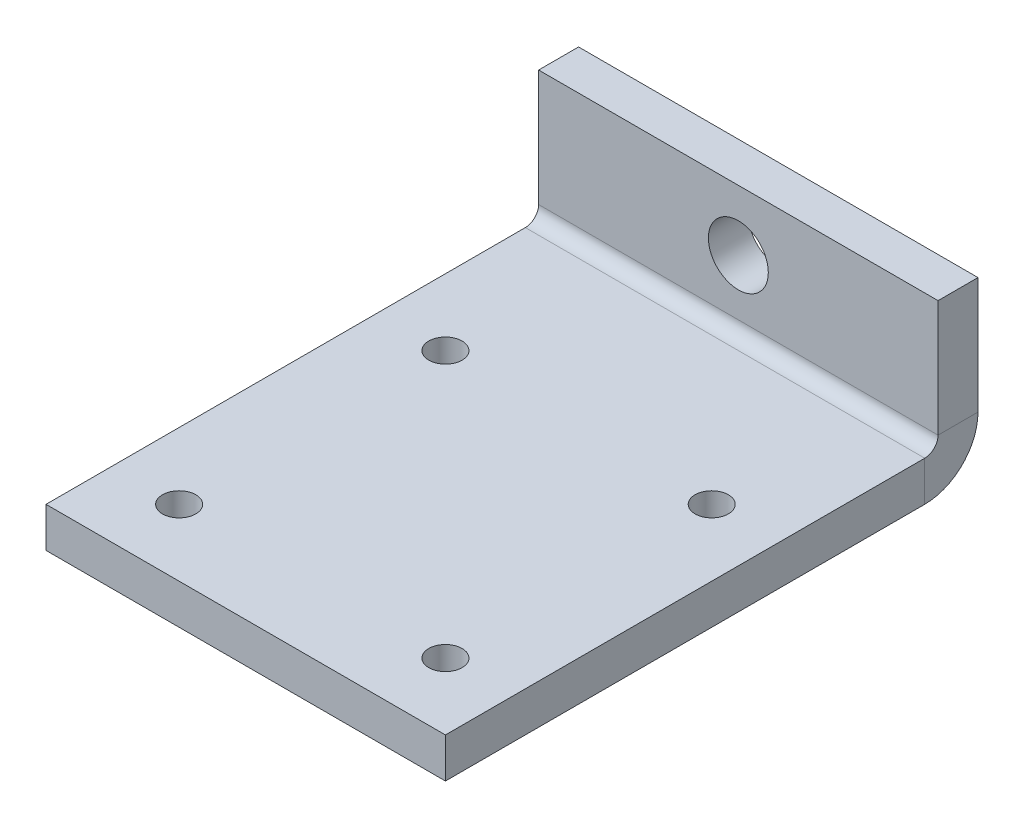
ISO-10303-21;
HEADER;
FILE_DESCRIPTION(('STEP AP214'),'2;1');
FILE_NAME('part.step','',(''),(''),'','','');
FILE_SCHEMA(('AUTOMOTIVE_DESIGN { 1 0 10303 214 1 1 1 1 }'));
ENDSEC;
DATA;
#1=APPLICATION_CONTEXT('core data for automotive mechanical design processes');
#2=APPLICATION_PROTOCOL_DEFINITION('international standard','automotive_design',2000,#1);
#3=PRODUCT_CONTEXT('',#1,'mechanical');
#4=PRODUCT('Part','Part','',(#3));
#5=PRODUCT_RELATED_PRODUCT_CATEGORY('part','',(#4));
#6=PRODUCT_DEFINITION_FORMATION('','',#4);
#7=PRODUCT_DEFINITION_CONTEXT('part definition',#1,'design');
#8=PRODUCT_DEFINITION('design','',#6,#7);
#9=PRODUCT_DEFINITION_SHAPE('','',#8);
#10=(LENGTH_UNIT() NAMED_UNIT(*) SI_UNIT(.MILLI.,.METRE.));
#11=(NAMED_UNIT(*) PLANE_ANGLE_UNIT() SI_UNIT($,.RADIAN.));
#12=(NAMED_UNIT(*) SI_UNIT($,.STERADIAN.) SOLID_ANGLE_UNIT());
#13=UNCERTAINTY_MEASURE_WITH_UNIT(LENGTH_MEASURE(1.E-05),#10,'distance_accuracy_value','');
#14=(GEOMETRIC_REPRESENTATION_CONTEXT(3) GLOBAL_UNCERTAINTY_ASSIGNED_CONTEXT((#13)) GLOBAL_UNIT_ASSIGNED_CONTEXT((#10,
#11,#12)) REPRESENTATION_CONTEXT('',''));
#15=CARTESIAN_POINT('',(0.,0.,0.));
#16=DIRECTION('',(0.,0.,1.));
#17=DIRECTION('',(1.,0.,0.));
#18=AXIS2_PLACEMENT_3D('',#15,#16,#17);
#19=CARTESIAN_POINT('',(30.,0.,4.));
#20=DIRECTION('',(1.,0.,0.));
#21=DIRECTION('',(0.,0.,-1.));
#22=AXIS2_PLACEMENT_3D('',#19,#20,#21);
#23=PLANE('',#22);
#24=DIRECTION('',(0.,1.,0.));
#25=VECTOR('',#24,1.);
#26=CARTESIAN_POINT('',(30.,0.,4.));
#27=LINE('',#26,#25);
#28=CARTESIAN_POINT('',(30.,0.,4.));
#29=VERTEX_POINT('',#28);
#30=CARTESIAN_POINT('',(30.,3.,4.));
#31=VERTEX_POINT('',#30);
#32=EDGE_CURVE('E11',#29,#31,#27,.T.);
#33=ORIENTED_EDGE('',*,*,#32,.F.);
#34=CARTESIAN_POINT('',(30.,4.,4.));
#35=DIRECTION('',(-1.,0.,0.));
#36=DIRECTION('',(0.,0.,1.));
#37=AXIS2_PLACEMENT_3D('',#34,#35,#36);
#38=CIRCLE('',#37,4.);
#39=CARTESIAN_POINT('',(30.,4.,0.));
#40=VERTEX_POINT('',#39);
#41=EDGE_CURVE('E128',#29,#40,#38,.F.);
#42=ORIENTED_EDGE('',*,*,#41,.T.);
#43=DIRECTION('',(0.,0.,-1.));
#44=VECTOR('',#43,1.);
#45=CARTESIAN_POINT('',(30.,4.,3.));
#46=LINE('',#45,#44);
#47=CARTESIAN_POINT('',(30.,4.,3.));
#48=VERTEX_POINT('',#47);
#49=EDGE_CURVE('E46',#48,#40,#46,.T.);
#50=ORIENTED_EDGE('',*,*,#49,.F.);
#51=CARTESIAN_POINT('',(30.,4.,4.));
#52=DIRECTION('',(1.,0.,0.));
#53=DIRECTION('',(0.,0.,-1.));
#54=AXIS2_PLACEMENT_3D('',#51,#52,#53);
#55=CIRCLE('',#54,1.);
#56=EDGE_CURVE('E135',#31,#48,#55,.T.);
#57=ORIENTED_EDGE('',*,*,#56,.F.);
#58=EDGE_LOOP('',(#33,#42,#50,#57));
#59=FACE_BOUND('',#58,.T.);
#60=ADVANCED_FACE('F38',(#59),#23,.T.);
#61=CARTESIAN_POINT('',(30.,4.,3.));
#62=DIRECTION('',(1.,0.,0.));
#63=DIRECTION('',(0.,0.,-1.));
#64=AXIS2_PLACEMENT_3D('',#61,#62,#63);
#65=PLANE('',#64);
#66=DIRECTION('',(0.,0.,-1.));
#67=VECTOR('',#66,1.);
#68=CARTESIAN_POINT('',(30.,0.,0.));
#69=LINE('',#68,#67);
#70=CARTESIAN_POINT('',(30.,0.,40.));
#71=VERTEX_POINT('',#70);
#72=EDGE_CURVE('E123',#71,#29,#69,.T.);
#73=ORIENTED_EDGE('',*,*,#72,.T.);
#74=ORIENTED_EDGE('',*,*,#32,.T.);
#75=DIRECTION('',(0.,0.,-1.));
#76=VECTOR('',#75,1.);
#77=CARTESIAN_POINT('',(30.,3.,0.));
#78=LINE('',#77,#76);
#79=CARTESIAN_POINT('',(30.,3.,40.));
#80=VERTEX_POINT('',#79);
#81=EDGE_CURVE('E133',#80,#31,#78,.T.);
#82=ORIENTED_EDGE('',*,*,#81,.F.);
#83=DIRECTION('',(0.,1.,0.));
#84=VECTOR('',#83,1.);
#85=CARTESIAN_POINT('',(30.,0.,40.));
#86=LINE('',#85,#84);
#87=EDGE_CURVE('E114',#71,#80,#86,.T.);
#88=ORIENTED_EDGE('',*,*,#87,.F.);
#89=EDGE_LOOP('',(#73,#74,#82,#88));
#90=FACE_BOUND('',#89,.T.);
#91=ADVANCED_FACE('F131',(#90),#65,.T.);
#92=CARTESIAN_POINT('',(0.,4.,0.));
#93=DIRECTION('',(-1.,0.,0.));
#94=DIRECTION('',(0.,0.,1.));
#95=AXIS2_PLACEMENT_3D('',#92,#93,#94);
#96=PLANE('',#95);
#97=DIRECTION('',(0.,0.,1.));
#98=VECTOR('',#97,1.);
#99=CARTESIAN_POINT('',(0.,4.,0.));
#100=LINE('',#99,#98);
#101=CARTESIAN_POINT('',(0.,4.,0.));
#102=VERTEX_POINT('',#101);
#103=CARTESIAN_POINT('',(0.,4.,3.));
#104=VERTEX_POINT('',#103);
#105=EDGE_CURVE('E89',#102,#104,#100,.T.);
#106=ORIENTED_EDGE('',*,*,#105,.F.);
#107=CARTESIAN_POINT('',(0.,4.,4.));
#108=DIRECTION('',(-1.,0.,0.));
#109=DIRECTION('',(0.,0.,1.));
#110=AXIS2_PLACEMENT_3D('',#107,#108,#109);
#111=CIRCLE('',#110,4.);
#112=CARTESIAN_POINT('',(0.,0.,4.));
#113=VERTEX_POINT('',#112);
#114=EDGE_CURVE('E158',#113,#102,#111,.F.);
#115=ORIENTED_EDGE('',*,*,#114,.F.);
#116=DIRECTION('',(0.,-1.,0.));
#117=VECTOR('',#116,1.);
#118=CARTESIAN_POINT('',(0.,3.,4.));
#119=LINE('',#118,#117);
#120=CARTESIAN_POINT('',(0.,3.,4.));
#121=VERTEX_POINT('',#120);
#122=EDGE_CURVE('E82',#121,#113,#119,.T.);
#123=ORIENTED_EDGE('',*,*,#122,.F.);
#124=CARTESIAN_POINT('',(0.,4.,4.));
#125=DIRECTION('',(1.,0.,0.));
#126=DIRECTION('',(0.,0.,-1.));
#127=AXIS2_PLACEMENT_3D('',#124,#125,#126);
#128=CIRCLE('',#127,1.);
#129=EDGE_CURVE('E151',#121,#104,#128,.T.);
#130=ORIENTED_EDGE('',*,*,#129,.T.);
#131=EDGE_LOOP('',(#106,#115,#123,#130));
#132=FACE_BOUND('',#131,.T.);
#133=ADVANCED_FACE('F190',(#132),#96,.T.);
#134=CARTESIAN_POINT('',(0.,3.,4.));
#135=DIRECTION('',(-1.,0.,0.));
#136=DIRECTION('',(0.,0.,1.));
#137=AXIS2_PLACEMENT_3D('',#134,#135,#136);
#138=PLANE('',#137);
#139=DIRECTION('',(0.,1.,0.));
#140=VECTOR('',#139,1.);
#141=CARTESIAN_POINT('',(0.,0.,0.));
#142=LINE('',#141,#140);
#143=CARTESIAN_POINT('',(0.,12.75,0.));
#144=VERTEX_POINT('',#143);
#145=EDGE_CURVE('E141',#102,#144,#142,.T.);
#146=ORIENTED_EDGE('',*,*,#145,.F.);
#147=ORIENTED_EDGE('',*,*,#105,.T.);
#148=DIRECTION('',(0.,1.,0.));
#149=VECTOR('',#148,1.);
#150=CARTESIAN_POINT('',(0.,0.,3.));
#151=LINE('',#150,#149);
#152=CARTESIAN_POINT('',(0.,12.75,3.));
#153=VERTEX_POINT('',#152);
#154=EDGE_CURVE('E148',#104,#153,#151,.T.);
#155=ORIENTED_EDGE('',*,*,#154,.T.);
#156=DIRECTION('',(0.,0.,-1.));
#157=VECTOR('',#156,1.);
#158=CARTESIAN_POINT('',(0.,12.75,3.));
#159=LINE('',#158,#157);
#160=EDGE_CURVE('E144',#153,#144,#159,.T.);
#161=ORIENTED_EDGE('',*,*,#160,.T.);
#162=EDGE_LOOP('',(#146,#147,#155,#161));
#163=FACE_BOUND('',#162,.T.);
#164=ADVANCED_FACE('F177',(#163),#138,.T.);
#165=CARTESIAN_POINT('',(30.,0.,0.));
#166=DIRECTION('',(0.,0.,1.));
#167=DIRECTION('',(1.,0.,0.));
#168=AXIS2_PLACEMENT_3D('',#165,#166,#167);
#169=PLANE('',#168);
#170=CARTESIAN_POINT('',(15.,8.2,0.));
#171=DIRECTION('',(0.,0.,1.));
#172=DIRECTION('',(1.,0.,0.));
#173=AXIS2_PLACEMENT_3D('',#170,#171,#172);
#174=CIRCLE('',#173,2.25);
#175=CARTESIAN_POINT('',(17.25,8.2,0.));
#176=VERTEX_POINT('',#175);
#177=EDGE_CURVE('E225',#176,#176,#174,.T.);
#178=ORIENTED_EDGE('',*,*,#177,.T.);
#179=EDGE_LOOP('',(#178));
#180=FACE_BOUND('',#179,.T.);
#181=ORIENTED_EDGE('',*,*,#145,.T.);
#182=DIRECTION('',(-1.,0.,0.));
#183=VECTOR('',#182,1.);
#184=CARTESIAN_POINT('',(30.,12.75,0.));
#185=LINE('',#184,#183);
#186=CARTESIAN_POINT('',(30.,12.75,0.));
#187=VERTEX_POINT('',#186);
#188=EDGE_CURVE('E172',#187,#144,#185,.T.);
#189=ORIENTED_EDGE('',*,*,#188,.F.);
#190=DIRECTION('',(0.,1.,0.));
#191=VECTOR('',#190,1.);
#192=CARTESIAN_POINT('',(30.,0.,0.));
#193=LINE('',#192,#191);
#194=EDGE_CURVE('E95',#40,#187,#193,.T.);
#195=ORIENTED_EDGE('',*,*,#194,.F.);
#196=DIRECTION('',(-1.,0.,0.));
#197=VECTOR('',#196,1.);
#198=CARTESIAN_POINT('',(30.,4.,0.));
#199=LINE('',#198,#197);
#200=EDGE_CURVE('E140',#40,#102,#199,.T.);
#201=ORIENTED_EDGE('',*,*,#200,.T.);
#202=EDGE_LOOP('',(#181,#189,#195,#201));
#203=FACE_BOUND('',#202,.T.);
#204=ADVANCED_FACE('F242',(#180,#203),#169,.F.);
#205=CARTESIAN_POINT('',(30.,12.75,3.));
#206=DIRECTION('',(0.,1.,0.));
#207=DIRECTION('',(0.,0.,1.));
#208=AXIS2_PLACEMENT_3D('',#205,#206,#207);
#209=PLANE('',#208);
#210=ORIENTED_EDGE('',*,*,#160,.F.);
#211=DIRECTION('',(-1.,0.,0.));
#212=VECTOR('',#211,1.);
#213=CARTESIAN_POINT('',(30.,12.75,3.));
#214=LINE('',#213,#212);
#215=CARTESIAN_POINT('',(30.,12.75,3.));
#216=VERTEX_POINT('',#215);
#217=EDGE_CURVE('E170',#216,#153,#214,.T.);
#218=ORIENTED_EDGE('',*,*,#217,.F.);
#219=DIRECTION('',(0.,0.,-1.));
#220=VECTOR('',#219,1.);
#221=CARTESIAN_POINT('',(30.,12.75,3.));
#222=LINE('',#221,#220);
#223=EDGE_CURVE('E196',#216,#187,#222,.T.);
#224=ORIENTED_EDGE('',*,*,#223,.T.);
#225=ORIENTED_EDGE('',*,*,#188,.T.);
#226=EDGE_LOOP('',(#210,#218,#224,#225));
#227=FACE_BOUND('',#226,.T.);
#228=ADVANCED_FACE('F235',(#227),#209,.T.);
#229=CARTESIAN_POINT('',(30.,0.,3.));
#230=DIRECTION('',(0.,0.,1.));
#231=DIRECTION('',(1.,0.,0.));
#232=AXIS2_PLACEMENT_3D('',#229,#230,#231);
#233=PLANE('',#232);
#234=CARTESIAN_POINT('',(15.,8.2,3.));
#235=DIRECTION('',(0.,0.,1.));
#236=DIRECTION('',(1.,0.,0.));
#237=AXIS2_PLACEMENT_3D('',#234,#235,#236);
#238=CIRCLE('',#237,2.25);
#239=CARTESIAN_POINT('',(17.25,8.2,3.));
#240=VERTEX_POINT('',#239);
#241=EDGE_CURVE('E228',#240,#240,#238,.T.);
#242=ORIENTED_EDGE('',*,*,#241,.F.);
#243=EDGE_LOOP('',(#242));
#244=FACE_BOUND('',#243,.T.);
#245=ORIENTED_EDGE('',*,*,#154,.F.);
#246=DIRECTION('',(-1.,0.,0.));
#247=VECTOR('',#246,1.);
#248=CARTESIAN_POINT('',(30.,4.,3.));
#249=LINE('',#248,#247);
#250=EDGE_CURVE('E167',#48,#104,#249,.T.);
#251=ORIENTED_EDGE('',*,*,#250,.F.);
#252=DIRECTION('',(0.,1.,0.));
#253=VECTOR('',#252,1.);
#254=CARTESIAN_POINT('',(30.,0.,3.));
#255=LINE('',#254,#253);
#256=EDGE_CURVE('E195',#48,#216,#255,.T.);
#257=ORIENTED_EDGE('',*,*,#256,.T.);
#258=ORIENTED_EDGE('',*,*,#217,.T.);
#259=EDGE_LOOP('',(#245,#251,#257,#258));
#260=FACE_BOUND('',#259,.T.);
#261=ADVANCED_FACE('F188',(#244,#260),#233,.T.);
#262=CARTESIAN_POINT('',(30.,4.,4.));
#263=DIRECTION('',(-1.,0.,0.));
#264=DIRECTION('',(0.,0.,1.));
#265=AXIS2_PLACEMENT_3D('',#262,#263,#264);
#266=CYLINDRICAL_SURFACE('',#265,1.);
#267=ORIENTED_EDGE('',*,*,#129,.F.);
#268=DIRECTION('',(-1.,0.,0.));
#269=VECTOR('',#268,1.);
#270=CARTESIAN_POINT('',(30.,3.,4.));
#271=LINE('',#270,#269);
#272=EDGE_CURVE('E164',#31,#121,#271,.T.);
#273=ORIENTED_EDGE('',*,*,#272,.F.);
#274=ORIENTED_EDGE('',*,*,#56,.T.);
#275=ORIENTED_EDGE('',*,*,#250,.T.);
#276=EDGE_LOOP('',(#267,#273,#274,#275));
#277=FACE_BOUND('',#276,.T.);
#278=ADVANCED_FACE('F183',(#277),#266,.F.);
#279=CARTESIAN_POINT('',(30.,3.,0.));
#280=DIRECTION('',(0.,1.,0.));
#281=DIRECTION('',(0.,0.,1.));
#282=AXIS2_PLACEMENT_3D('',#279,#280,#281);
#283=PLANE('',#282);
#284=CARTESIAN_POINT('',(5.,3.,35.));
#285=DIRECTION('',(0.,1.,0.));
#286=DIRECTION('',(0.,0.,1.));
#287=AXIS2_PLACEMENT_3D('',#284,#285,#286);
#288=CIRCLE('',#287,1.24999999999999);
#289=CARTESIAN_POINT('',(5.,3.,36.25));
#290=VERTEX_POINT('',#289);
#291=EDGE_CURVE('E222',#290,#290,#288,.T.);
#292=ORIENTED_EDGE('',*,*,#291,.F.);
#293=EDGE_LOOP('',(#292));
#294=FACE_BOUND('',#293,.T.);
#295=CARTESIAN_POINT('',(5.,3.,15.));
#296=DIRECTION('',(0.,1.,0.));
#297=DIRECTION('',(0.,0.,1.));
#298=AXIS2_PLACEMENT_3D('',#295,#296,#297);
#299=CIRCLE('',#298,1.24999999999999);
#300=CARTESIAN_POINT('',(5.,3.,16.25));
#301=VERTEX_POINT('',#300);
#302=EDGE_CURVE('E216',#301,#301,#299,.T.);
#303=ORIENTED_EDGE('',*,*,#302,.F.);
#304=EDGE_LOOP('',(#303));
#305=FACE_BOUND('',#304,.T.);
#306=CARTESIAN_POINT('',(25.,3.,15.));
#307=DIRECTION('',(0.,1.,0.));
#308=DIRECTION('',(0.,0.,1.));
#309=AXIS2_PLACEMENT_3D('',#306,#307,#308);
#310=CIRCLE('',#309,1.24999999999999);
#311=CARTESIAN_POINT('',(25.,3.,16.25));
#312=VERTEX_POINT('',#311);
#313=EDGE_CURVE('E210',#312,#312,#310,.T.);
#314=ORIENTED_EDGE('',*,*,#313,.F.);
#315=EDGE_LOOP('',(#314));
#316=FACE_BOUND('',#315,.T.);
#317=CARTESIAN_POINT('',(25.,3.,35.));
#318=DIRECTION('',(0.,1.,0.));
#319=DIRECTION('',(0.,0.,1.));
#320=AXIS2_PLACEMENT_3D('',#317,#318,#319);
#321=CIRCLE('',#320,1.24999999999999);
#322=CARTESIAN_POINT('',(25.,3.,36.25));
#323=VERTEX_POINT('',#322);
#324=EDGE_CURVE('E204',#323,#323,#321,.T.);
#325=ORIENTED_EDGE('',*,*,#324,.F.);
#326=EDGE_LOOP('',(#325));
#327=FACE_BOUND('',#326,.T.);
#328=DIRECTION('',(0.,0.,-1.));
#329=VECTOR('',#328,1.);
#330=CARTESIAN_POINT('',(0.,3.,0.));
#331=LINE('',#330,#329);
#332=CARTESIAN_POINT('',(0.,3.,40.));
#333=VERTEX_POINT('',#332);
#334=EDGE_CURVE('E153',#333,#121,#331,.T.);
#335=ORIENTED_EDGE('',*,*,#334,.F.);
#336=DIRECTION('',(-1.,0.,0.));
#337=VECTOR('',#336,1.);
#338=CARTESIAN_POINT('',(30.,3.,40.));
#339=LINE('',#338,#337);
#340=EDGE_CURVE('E118',#80,#333,#339,.T.);
#341=ORIENTED_EDGE('',*,*,#340,.F.);
#342=ORIENTED_EDGE('',*,*,#81,.T.);
#343=ORIENTED_EDGE('',*,*,#272,.T.);
#344=EDGE_LOOP('',(#335,#341,#342,#343));
#345=FACE_BOUND('',#344,.T.);
#346=ADVANCED_FACE('F193',(#294,#305,#316,#327,#345),#283,.T.);
#347=CARTESIAN_POINT('',(30.,0.,40.));
#348=DIRECTION('',(0.,0.,1.));
#349=DIRECTION('',(1.,0.,0.));
#350=AXIS2_PLACEMENT_3D('',#347,#348,#349);
#351=PLANE('',#350);
#352=DIRECTION('',(0.,1.,0.));
#353=VECTOR('',#352,1.);
#354=CARTESIAN_POINT('',(0.,0.,40.));
#355=LINE('',#354,#353);
#356=CARTESIAN_POINT('',(0.,0.,40.));
#357=VERTEX_POINT('',#356);
#358=EDGE_CURVE('E116',#357,#333,#355,.T.);
#359=ORIENTED_EDGE('',*,*,#358,.F.);
#360=DIRECTION('',(-1.,0.,0.));
#361=VECTOR('',#360,1.);
#362=CARTESIAN_POINT('',(30.,0.,40.));
#363=LINE('',#362,#361);
#364=EDGE_CURVE('E110',#71,#357,#363,.T.);
#365=ORIENTED_EDGE('',*,*,#364,.F.);
#366=ORIENTED_EDGE('',*,*,#87,.T.);
#367=ORIENTED_EDGE('',*,*,#340,.T.);
#368=EDGE_LOOP('',(#359,#365,#366,#367));
#369=FACE_BOUND('',#368,.T.);
#370=ADVANCED_FACE('F112',(#369),#351,.T.);
#371=CARTESIAN_POINT('',(30.,0.,0.));
#372=DIRECTION('',(0.,1.,0.));
#373=DIRECTION('',(0.,0.,1.));
#374=AXIS2_PLACEMENT_3D('',#371,#372,#373);
#375=PLANE('',#374);
#376=CARTESIAN_POINT('',(5.,0.,35.));
#377=DIRECTION('',(0.,1.,0.));
#378=DIRECTION('',(0.,0.,1.));
#379=AXIS2_PLACEMENT_3D('',#376,#377,#378);
#380=CIRCLE('',#379,1.24999999999999);
#381=CARTESIAN_POINT('',(5.,0.,36.25));
#382=VERTEX_POINT('',#381);
#383=EDGE_CURVE('E219',#382,#382,#380,.T.);
#384=ORIENTED_EDGE('',*,*,#383,.T.);
#385=EDGE_LOOP('',(#384));
#386=FACE_BOUND('',#385,.T.);
#387=CARTESIAN_POINT('',(5.,0.,15.));
#388=DIRECTION('',(0.,1.,0.));
#389=DIRECTION('',(0.,0.,1.));
#390=AXIS2_PLACEMENT_3D('',#387,#388,#389);
#391=CIRCLE('',#390,1.24999999999999);
#392=CARTESIAN_POINT('',(5.,0.,16.25));
#393=VERTEX_POINT('',#392);
#394=EDGE_CURVE('E213',#393,#393,#391,.T.);
#395=ORIENTED_EDGE('',*,*,#394,.T.);
#396=EDGE_LOOP('',(#395));
#397=FACE_BOUND('',#396,.T.);
#398=CARTESIAN_POINT('',(25.,0.,15.));
#399=DIRECTION('',(0.,1.,0.));
#400=DIRECTION('',(0.,0.,1.));
#401=AXIS2_PLACEMENT_3D('',#398,#399,#400);
#402=CIRCLE('',#401,1.24999999999999);
#403=CARTESIAN_POINT('',(25.,0.,16.25));
#404=VERTEX_POINT('',#403);
#405=EDGE_CURVE('E207',#404,#404,#402,.T.);
#406=ORIENTED_EDGE('',*,*,#405,.T.);
#407=EDGE_LOOP('',(#406));
#408=FACE_BOUND('',#407,.T.);
#409=CARTESIAN_POINT('',(25.,0.,35.));
#410=DIRECTION('',(0.,1.,0.));
#411=DIRECTION('',(0.,0.,1.));
#412=AXIS2_PLACEMENT_3D('',#409,#410,#411);
#413=CIRCLE('',#412,1.24999999999999);
#414=CARTESIAN_POINT('',(25.,0.,36.25));
#415=VERTEX_POINT('',#414);
#416=EDGE_CURVE('E145',#415,#415,#413,.T.);
#417=ORIENTED_EDGE('',*,*,#416,.T.);
#418=EDGE_LOOP('',(#417));
#419=FACE_BOUND('',#418,.T.);
#420=DIRECTION('',(0.,0.,-1.));
#421=VECTOR('',#420,1.);
#422=CARTESIAN_POINT('',(0.,0.,0.));
#423=LINE('',#422,#421);
#424=EDGE_CURVE('E156',#357,#113,#423,.T.);
#425=ORIENTED_EDGE('',*,*,#424,.T.);
#426=DIRECTION('',(-1.,0.,0.));
#427=VECTOR('',#426,1.);
#428=CARTESIAN_POINT('',(30.,0.,4.));
#429=LINE('',#428,#427);
#430=EDGE_CURVE('E119',#29,#113,#429,.T.);
#431=ORIENTED_EDGE('',*,*,#430,.F.);
#432=ORIENTED_EDGE('',*,*,#72,.F.);
#433=ORIENTED_EDGE('',*,*,#364,.T.);
#434=EDGE_LOOP('',(#425,#431,#432,#433));
#435=FACE_BOUND('',#434,.T.);
#436=ADVANCED_FACE('F124',(#386,#397,#408,#419,#435),#375,.F.);
#437=CARTESIAN_POINT('',(30.,4.,4.));
#438=DIRECTION('',(-1.,0.,0.));
#439=DIRECTION('',(0.,0.,1.));
#440=AXIS2_PLACEMENT_3D('',#437,#438,#439);
#441=CYLINDRICAL_SURFACE('',#440,4.);
#442=ORIENTED_EDGE('',*,*,#114,.T.);
#443=ORIENTED_EDGE('',*,*,#200,.F.);
#444=ORIENTED_EDGE('',*,*,#41,.F.);
#445=ORIENTED_EDGE('',*,*,#430,.T.);
#446=EDGE_LOOP('',(#442,#443,#444,#445));
#447=FACE_BOUND('',#446,.T.);
#448=ADVANCED_FACE('F266',(#447),#441,.T.);
#449=CARTESIAN_POINT('',(30.,4.,4.));
#450=DIRECTION('',(1.,0.,0.));
#451=DIRECTION('',(0.,0.,-1.));
#452=AXIS2_PLACEMENT_3D('',#449,#450,#451);
#453=PLANE('',#452);
#454=ORIENTED_EDGE('',*,*,#194,.T.);
#455=ORIENTED_EDGE('',*,*,#223,.F.);
#456=ORIENTED_EDGE('',*,*,#256,.F.);
#457=ORIENTED_EDGE('',*,*,#49,.T.);
#458=EDGE_LOOP('',(#454,#455,#456,#457));
#459=FACE_BOUND('',#458,.T.);
#460=ADVANCED_FACE('F263',(#459),#453,.T.);
#461=CARTESIAN_POINT('',(0.,4.,4.));
#462=DIRECTION('',(1.,0.,0.));
#463=DIRECTION('',(0.,0.,-1.));
#464=AXIS2_PLACEMENT_3D('',#461,#462,#463);
#465=PLANE('',#464);
#466=ORIENTED_EDGE('',*,*,#334,.T.);
#467=ORIENTED_EDGE('',*,*,#122,.T.);
#468=ORIENTED_EDGE('',*,*,#424,.F.);
#469=ORIENTED_EDGE('',*,*,#358,.T.);
#470=EDGE_LOOP('',(#466,#467,#468,#469));
#471=FACE_BOUND('',#470,.T.);
#472=ADVANCED_FACE('F265',(#471),#465,.F.);
#473=CARTESIAN_POINT('',(25.,3.,35.));
#474=DIRECTION('',(0.,1.,0.));
#475=DIRECTION('',(0.,0.,1.));
#476=AXIS2_PLACEMENT_3D('',#473,#474,#475);
#477=CYLINDRICAL_SURFACE('',#476,1.24999999999999);
#478=ORIENTED_EDGE('',*,*,#416,.F.);
#479=EDGE_LOOP('',(#478));
#480=FACE_BOUND('',#479,.T.);
#481=ORIENTED_EDGE('',*,*,#324,.T.);
#482=EDGE_LOOP('',(#481));
#483=FACE_BOUND('',#482,.T.);
#484=ADVANCED_FACE('F272',(#480,#483),#477,.F.);
#485=CARTESIAN_POINT('',(25.,3.,15.));
#486=DIRECTION('',(0.,1.,0.));
#487=DIRECTION('',(0.,0.,1.));
#488=AXIS2_PLACEMENT_3D('',#485,#486,#487);
#489=CYLINDRICAL_SURFACE('',#488,1.24999999999999);
#490=ORIENTED_EDGE('',*,*,#405,.F.);
#491=EDGE_LOOP('',(#490));
#492=FACE_BOUND('',#491,.T.);
#493=ORIENTED_EDGE('',*,*,#313,.T.);
#494=EDGE_LOOP('',(#493));
#495=FACE_BOUND('',#494,.T.);
#496=ADVANCED_FACE('F297',(#492,#495),#489,.F.);
#497=CARTESIAN_POINT('',(5.,3.,15.));
#498=DIRECTION('',(0.,1.,0.));
#499=DIRECTION('',(0.,0.,1.));
#500=AXIS2_PLACEMENT_3D('',#497,#498,#499);
#501=CYLINDRICAL_SURFACE('',#500,1.24999999999999);
#502=ORIENTED_EDGE('',*,*,#394,.F.);
#503=EDGE_LOOP('',(#502));
#504=FACE_BOUND('',#503,.T.);
#505=ORIENTED_EDGE('',*,*,#302,.T.);
#506=EDGE_LOOP('',(#505));
#507=FACE_BOUND('',#506,.T.);
#508=ADVANCED_FACE('F302',(#504,#507),#501,.F.);
#509=CARTESIAN_POINT('',(5.,3.,35.));
#510=DIRECTION('',(0.,1.,0.));
#511=DIRECTION('',(0.,0.,1.));
#512=AXIS2_PLACEMENT_3D('',#509,#510,#511);
#513=CYLINDRICAL_SURFACE('',#512,1.24999999999999);
#514=ORIENTED_EDGE('',*,*,#383,.F.);
#515=EDGE_LOOP('',(#514));
#516=FACE_BOUND('',#515,.T.);
#517=ORIENTED_EDGE('',*,*,#291,.T.);
#518=EDGE_LOOP('',(#517));
#519=FACE_BOUND('',#518,.T.);
#520=ADVANCED_FACE('F309',(#516,#519),#513,.F.);
#521=CARTESIAN_POINT('',(15.,8.2,3.));
#522=DIRECTION('',(0.,0.,1.));
#523=DIRECTION('',(1.,0.,0.));
#524=AXIS2_PLACEMENT_3D('',#521,#522,#523);
#525=CYLINDRICAL_SURFACE('',#524,2.25);
#526=ORIENTED_EDGE('',*,*,#177,.F.);
#527=EDGE_LOOP('',(#526));
#528=FACE_BOUND('',#527,.T.);
#529=ORIENTED_EDGE('',*,*,#241,.T.);
#530=EDGE_LOOP('',(#529));
#531=FACE_BOUND('',#530,.T.);
#532=ADVANCED_FACE('F232',(#528,#531),#525,.F.);
#533=CLOSED_SHELL('',(#60,#91,#133,#164,#204,#228,#261,#278,#346,#370,#436,#448,#460,#472,#484,
#496,#508,#520,#532));
#534=MANIFOLD_SOLID_BREP('B2',#533);
#535=ADVANCED_BREP_SHAPE_REPRESENTATION('',(#18,#534),#14);
#536=SHAPE_DEFINITION_REPRESENTATION(#9,#535);
ENDSEC;
END-ISO-10303-21;
